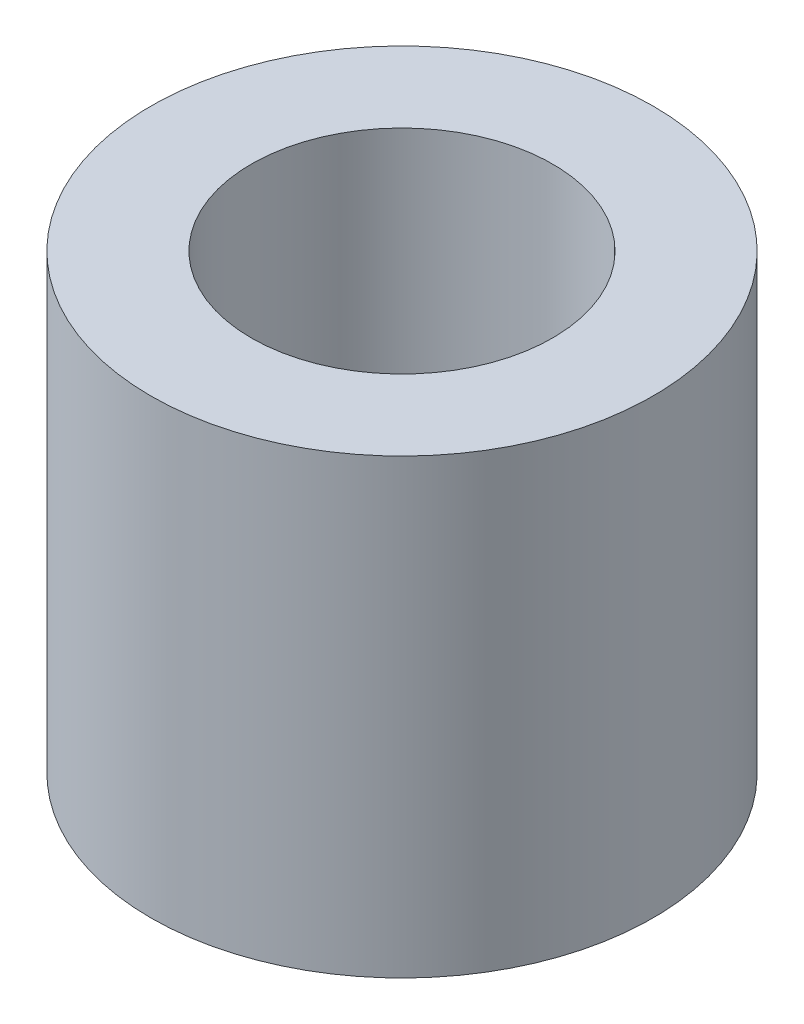
ISO-10303-21;
HEADER;
FILE_DESCRIPTION(('STEP AP214'),'2;1');
FILE_NAME('part.step','',(''),(''),'','','');
FILE_SCHEMA(('AUTOMOTIVE_DESIGN { 1 0 10303 214 1 1 1 1 }'));
ENDSEC;
DATA;
#1=APPLICATION_CONTEXT('core data for automotive mechanical design processes');
#2=APPLICATION_PROTOCOL_DEFINITION('international standard','automotive_design',2000,#1);
#3=PRODUCT_CONTEXT('',#1,'mechanical');
#4=PRODUCT('Part','Part','',(#3));
#5=PRODUCT_RELATED_PRODUCT_CATEGORY('part','',(#4));
#6=PRODUCT_DEFINITION_FORMATION('','',#4);
#7=PRODUCT_DEFINITION_CONTEXT('part definition',#1,'design');
#8=PRODUCT_DEFINITION('design','',#6,#7);
#9=PRODUCT_DEFINITION_SHAPE('','',#8);
#10=(LENGTH_UNIT() NAMED_UNIT(*) SI_UNIT(.MILLI.,.METRE.));
#11=(NAMED_UNIT(*) PLANE_ANGLE_UNIT() SI_UNIT($,.RADIAN.));
#12=(NAMED_UNIT(*) SI_UNIT($,.STERADIAN.) SOLID_ANGLE_UNIT());
#13=UNCERTAINTY_MEASURE_WITH_UNIT(LENGTH_MEASURE(1.E-05),#10,'distance_accuracy_value','');
#14=(GEOMETRIC_REPRESENTATION_CONTEXT(3) GLOBAL_UNCERTAINTY_ASSIGNED_CONTEXT((#13)) GLOBAL_UNIT_ASSIGNED_CONTEXT((#10,
#11,#12)) REPRESENTATION_CONTEXT('',''));
#15=CARTESIAN_POINT('',(0.,0.,0.));
#16=DIRECTION('',(0.,0.,1.));
#17=DIRECTION('',(1.,0.,0.));
#18=AXIS2_PLACEMENT_3D('',#15,#16,#17);
#19=CARTESIAN_POINT('',(0.,-4.5,0.));
#20=DIRECTION('',(0.,1.,0.));
#21=DIRECTION('',(0.,0.,1.));
#22=AXIS2_PLACEMENT_3D('',#19,#20,#21);
#23=CYLINDRICAL_SURFACE('',#22,5.);
#24=CARTESIAN_POINT('',(0.,-4.5,0.));
#25=DIRECTION('',(0.,1.,0.));
#26=DIRECTION('',(0.,0.,1.));
#27=AXIS2_PLACEMENT_3D('',#24,#25,#26);
#28=CIRCLE('',#27,5.);
#29=CARTESIAN_POINT('',(0.,-4.5,5.));
#30=VERTEX_POINT('',#29);
#31=EDGE_CURVE('E10',#30,#30,#28,.T.);
#32=ORIENTED_EDGE('',*,*,#31,.T.);
#33=EDGE_LOOP('',(#32));
#34=FACE_BOUND('',#33,.T.);
#35=CARTESIAN_POINT('',(0.,4.5,0.));
#36=DIRECTION('',(0.,1.,0.));
#37=DIRECTION('',(0.,0.,1.));
#38=AXIS2_PLACEMENT_3D('',#35,#36,#37);
#39=CIRCLE('',#38,5.);
#40=CARTESIAN_POINT('',(0.,4.5,5.));
#41=VERTEX_POINT('',#40);
#42=EDGE_CURVE('E49',#41,#41,#39,.T.);
#43=ORIENTED_EDGE('',*,*,#42,.F.);
#44=EDGE_LOOP('',(#43));
#45=FACE_BOUND('',#44,.T.);
#46=ADVANCED_FACE('F37',(#34,#45),#23,.T.);
#47=CARTESIAN_POINT('',(0.,-4.5,0.));
#48=DIRECTION('',(0.,1.,0.));
#49=DIRECTION('',(0.,0.,1.));
#50=AXIS2_PLACEMENT_3D('',#47,#48,#49);
#51=PLANE('',#50);
#52=CARTESIAN_POINT('',(0.,-4.5,0.));
#53=DIRECTION('',(0.,1.,0.));
#54=DIRECTION('',(0.,0.,1.));
#55=AXIS2_PLACEMENT_3D('',#52,#53,#54);
#56=CIRCLE('',#55,3.);
#57=CARTESIAN_POINT('',(0.,-4.5,3.));
#58=VERTEX_POINT('',#57);
#59=EDGE_CURVE('E44',#58,#58,#56,.T.);
#60=ORIENTED_EDGE('',*,*,#59,.T.);
#61=EDGE_LOOP('',(#60));
#62=FACE_BOUND('',#61,.T.);
#63=ORIENTED_EDGE('',*,*,#31,.F.);
#64=EDGE_LOOP('',(#63));
#65=FACE_BOUND('',#64,.T.);
#66=ADVANCED_FACE('F70',(#62,#65),#51,.F.);
#67=CARTESIAN_POINT('',(0.,-4.5,0.));
#68=DIRECTION('',(0.,1.,0.));
#69=DIRECTION('',(0.,0.,1.));
#70=AXIS2_PLACEMENT_3D('',#67,#68,#69);
#71=CYLINDRICAL_SURFACE('',#70,3.);
#72=ORIENTED_EDGE('',*,*,#59,.F.);
#73=EDGE_LOOP('',(#72));
#74=FACE_BOUND('',#73,.T.);
#75=CARTESIAN_POINT('',(0.,4.5,0.));
#76=DIRECTION('',(0.,1.,0.));
#77=DIRECTION('',(0.,0.,1.));
#78=AXIS2_PLACEMENT_3D('',#75,#76,#77);
#79=CIRCLE('',#78,3.);
#80=CARTESIAN_POINT('',(0.,4.5,3.));
#81=VERTEX_POINT('',#80);
#82=EDGE_CURVE('E54',#81,#81,#79,.T.);
#83=ORIENTED_EDGE('',*,*,#82,.T.);
#84=EDGE_LOOP('',(#83));
#85=FACE_BOUND('',#84,.T.);
#86=ADVANCED_FACE('F61',(#74,#85),#71,.F.);
#87=CARTESIAN_POINT('',(0.,4.5,0.));
#88=DIRECTION('',(0.,1.,0.));
#89=DIRECTION('',(0.,0.,1.));
#90=AXIS2_PLACEMENT_3D('',#87,#88,#89);
#91=PLANE('',#90);
#92=ORIENTED_EDGE('',*,*,#42,.T.);
#93=EDGE_LOOP('',(#92));
#94=FACE_BOUND('',#93,.T.);
#95=ORIENTED_EDGE('',*,*,#82,.F.);
#96=EDGE_LOOP('',(#95));
#97=FACE_BOUND('',#96,.T.);
#98=ADVANCED_FACE('F63',(#94,#97),#91,.T.);
#99=CLOSED_SHELL('',(#46,#66,#86,#98));
#100=MANIFOLD_SOLID_BREP('B2',#99);
#101=ADVANCED_BREP_SHAPE_REPRESENTATION('',(#18,#100),#14);
#102=SHAPE_DEFINITION_REPRESENTATION(#9,#101);
ENDSEC;
END-ISO-10303-21;
